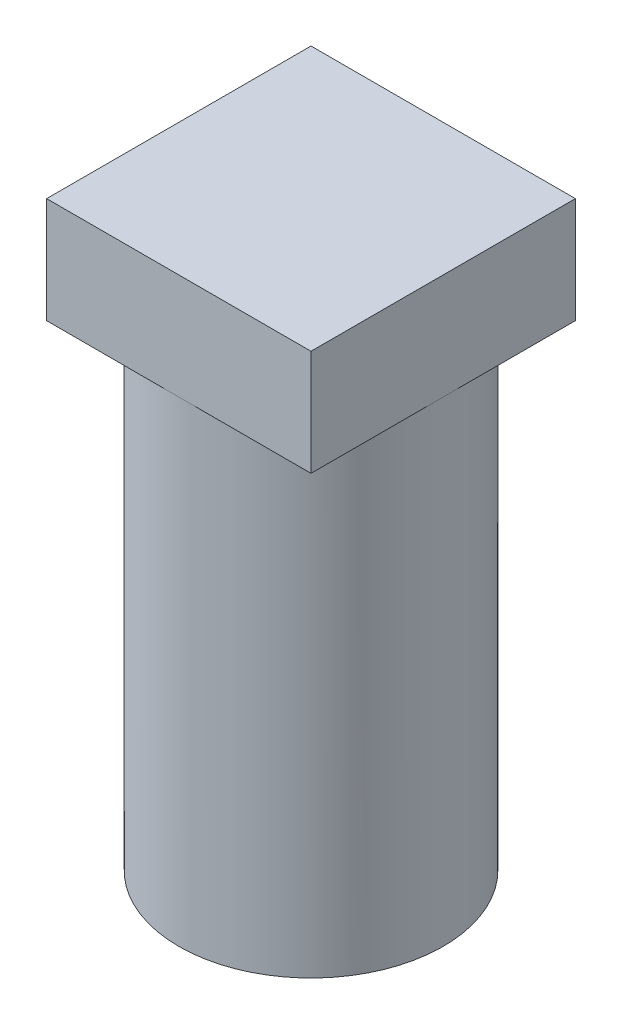
ISO-10303-21;
HEADER;
FILE_DESCRIPTION(('STEP AP214'),'2;1');
FILE_NAME('part.step','',(''),(''),'','','');
FILE_SCHEMA(('AUTOMOTIVE_DESIGN { 1 0 10303 214 1 1 1 1 }'));
ENDSEC;
DATA;
#1=APPLICATION_CONTEXT('core data for automotive mechanical design processes');
#2=APPLICATION_PROTOCOL_DEFINITION('international standard','automotive_design',2000,#1);
#3=PRODUCT_CONTEXT('',#1,'mechanical');
#4=PRODUCT('Part','Part','',(#3));
#5=PRODUCT_RELATED_PRODUCT_CATEGORY('part','',(#4));
#6=PRODUCT_DEFINITION_FORMATION('','',#4);
#7=PRODUCT_DEFINITION_CONTEXT('part definition',#1,'design');
#8=PRODUCT_DEFINITION('design','',#6,#7);
#9=PRODUCT_DEFINITION_SHAPE('','',#8);
#10=(LENGTH_UNIT() NAMED_UNIT(*) SI_UNIT(.MILLI.,.METRE.));
#11=(NAMED_UNIT(*) PLANE_ANGLE_UNIT() SI_UNIT($,.RADIAN.));
#12=(NAMED_UNIT(*) SI_UNIT($,.STERADIAN.) SOLID_ANGLE_UNIT());
#13=UNCERTAINTY_MEASURE_WITH_UNIT(LENGTH_MEASURE(1.E-05),#10,'distance_accuracy_value','');
#14=(GEOMETRIC_REPRESENTATION_CONTEXT(3) GLOBAL_UNCERTAINTY_ASSIGNED_CONTEXT((#13)) GLOBAL_UNIT_ASSIGNED_CONTEXT((#10,
#11,#12)) REPRESENTATION_CONTEXT('',''));
#15=CARTESIAN_POINT('',(0.,0.,0.));
#16=DIRECTION('',(0.,0.,1.));
#17=DIRECTION('',(1.,0.,0.));
#18=AXIS2_PLACEMENT_3D('',#15,#16,#17);
#19=CARTESIAN_POINT('',(0.,12.2870211444059,0.));
#20=DIRECTION('',(0.,-1.,0.));
#21=DIRECTION('',(0.,0.,-1.));
#22=AXIS2_PLACEMENT_3D('',#19,#20,#21);
#23=CYLINDRICAL_SURFACE('',#22,5.);
#24=CARTESIAN_POINT('',(0.,12.2870211444059,0.));
#25=DIRECTION('',(0.,1.,0.));
#26=DIRECTION('',(0.,0.,1.));
#27=AXIS2_PLACEMENT_3D('',#24,#25,#26);
#28=CIRCLE('',#27,5.);
#29=CARTESIAN_POINT('',(0.,12.2870211444059,5.));
#30=VERTEX_POINT('',#29);
#31=CARTESIAN_POINT('',(5.,12.2870211444059,0.));
#32=VERTEX_POINT('',#31);
#33=EDGE_CURVE('E11',#30,#32,#28,.T.);
#34=ORIENTED_EDGE('',*,*,#33,.F.);
#35=CARTESIAN_POINT('',(-5.,12.2870211444059,0.));
#36=VERTEX_POINT('',#35);
#37=EDGE_CURVE('E49',#36,#30,#28,.T.);
#38=ORIENTED_EDGE('',*,*,#37,.F.);
#39=CARTESIAN_POINT('',(0.,12.2870211444059,-5.));
#40=VERTEX_POINT('',#39);
#41=EDGE_CURVE('E59',#40,#36,#28,.T.);
#42=ORIENTED_EDGE('',*,*,#41,.F.);
#43=EDGE_CURVE('E48',#32,#40,#28,.T.);
#44=ORIENTED_EDGE('',*,*,#43,.F.);
#45=EDGE_LOOP('',(#34,#38,#42,#44));
#46=FACE_BOUND('',#45,.T.);
#47=CARTESIAN_POINT('',(0.,-5.71297885559409,0.));
#48=DIRECTION('',(0.,1.,0.));
#49=DIRECTION('',(0.,0.,1.));
#50=AXIS2_PLACEMENT_3D('',#47,#48,#49);
#51=CIRCLE('',#50,5.);
#52=CARTESIAN_POINT('',(0.,-5.71297885559409,5.));
#53=VERTEX_POINT('',#52);
#54=EDGE_CURVE('E43',#53,#53,#51,.T.);
#55=ORIENTED_EDGE('',*,*,#54,.T.);
#56=EDGE_LOOP('',(#55));
#57=FACE_BOUND('',#56,.T.);
#58=ADVANCED_FACE('F40',(#46,#57),#23,.T.);
#59=CARTESIAN_POINT('',(0.,-5.71297885559409,0.));
#60=DIRECTION('',(0.,1.,0.));
#61=DIRECTION('',(0.,0.,1.));
#62=AXIS2_PLACEMENT_3D('',#59,#60,#61);
#63=PLANE('',#62);
#64=ORIENTED_EDGE('',*,*,#54,.F.);
#65=EDGE_LOOP('',(#64));
#66=FACE_BOUND('',#65,.T.);
#67=ADVANCED_FACE('F169',(#66),#63,.F.);
#68=CARTESIAN_POINT('',(0.,12.2870211444059,0.));
#69=DIRECTION('',(0.,1.,0.));
#70=DIRECTION('',(0.,0.,1.));
#71=AXIS2_PLACEMENT_3D('',#68,#69,#70);
#72=PLANE('',#71);
#73=DIRECTION('',(1.,0.,0.));
#74=VECTOR('',#73,1.);
#75=CARTESIAN_POINT('',(-5.,12.2870211444059,5.));
#76=LINE('',#75,#74);
#77=CARTESIAN_POINT('',(5.,12.2870211444059,5.));
#78=VERTEX_POINT('',#77);
#79=EDGE_CURVE('E129',#30,#78,#76,.T.);
#80=ORIENTED_EDGE('',*,*,#79,.F.);
#81=ORIENTED_EDGE('',*,*,#33,.T.);
#82=DIRECTION('',(0.,0.,-1.));
#83=VECTOR('',#82,1.);
#84=CARTESIAN_POINT('',(5.,12.2870211444059,-5.));
#85=LINE('',#84,#83);
#86=EDGE_CURVE('E137',#78,#32,#85,.T.);
#87=ORIENTED_EDGE('',*,*,#86,.F.);
#88=EDGE_LOOP('',(#80,#81,#87));
#89=FACE_BOUND('',#88,.T.);
#90=ADVANCED_FACE('F150',(#89),#72,.F.);
#91=CARTESIAN_POINT('',(5.,12.2870211444059,-5.));
#92=VERTEX_POINT('',#91);
#93=EDGE_CURVE('E116',#32,#92,#85,.T.);
#94=ORIENTED_EDGE('',*,*,#93,.F.);
#95=ORIENTED_EDGE('',*,*,#43,.T.);
#96=DIRECTION('',(-1.,0.,0.));
#97=VECTOR('',#96,1.);
#98=CARTESIAN_POINT('',(-5.,12.2870211444059,-5.));
#99=LINE('',#98,#97);
#100=EDGE_CURVE('E134',#92,#40,#99,.T.);
#101=ORIENTED_EDGE('',*,*,#100,.F.);
#102=EDGE_LOOP('',(#94,#95,#101));
#103=FACE_BOUND('',#102,.T.);
#104=ADVANCED_FACE('F152',(#103),#72,.F.);
#105=CARTESIAN_POINT('',(-5.,12.2870211444059,-5.));
#106=VERTEX_POINT('',#105);
#107=EDGE_CURVE('E136',#40,#106,#99,.T.);
#108=ORIENTED_EDGE('',*,*,#107,.F.);
#109=ORIENTED_EDGE('',*,*,#41,.T.);
#110=DIRECTION('',(0.,0.,1.));
#111=VECTOR('',#110,1.);
#112=CARTESIAN_POINT('',(-5.,12.2870211444059,-5.));
#113=LINE('',#112,#111);
#114=EDGE_CURVE('E130',#106,#36,#113,.T.);
#115=ORIENTED_EDGE('',*,*,#114,.F.);
#116=EDGE_LOOP('',(#108,#109,#115));
#117=FACE_BOUND('',#116,.T.);
#118=ADVANCED_FACE('F156',(#117),#72,.F.);
#119=CARTESIAN_POINT('',(-5.,12.2870211444059,5.));
#120=VERTEX_POINT('',#119);
#121=EDGE_CURVE('E133',#36,#120,#113,.T.);
#122=ORIENTED_EDGE('',*,*,#121,.F.);
#123=ORIENTED_EDGE('',*,*,#37,.T.);
#124=EDGE_CURVE('E111',#120,#30,#76,.T.);
#125=ORIENTED_EDGE('',*,*,#124,.F.);
#126=EDGE_LOOP('',(#122,#123,#125));
#127=FACE_BOUND('',#126,.T.);
#128=ADVANCED_FACE('F158',(#127),#72,.F.);
#129=CARTESIAN_POINT('',(5.,16.2870211444059,-5.));
#130=DIRECTION('',(-1.,0.,0.));
#131=DIRECTION('',(0.,0.,1.));
#132=AXIS2_PLACEMENT_3D('',#129,#130,#131);
#133=PLANE('',#132);
#134=ORIENTED_EDGE('',*,*,#86,.T.);
#135=ORIENTED_EDGE('',*,*,#93,.T.);
#136=DIRECTION('',(0.,-1.,0.));
#137=VECTOR('',#136,1.);
#138=CARTESIAN_POINT('',(5.,16.2870211444059,-5.));
#139=LINE('',#138,#137);
#140=CARTESIAN_POINT('',(5.,16.2870211444059,-5.));
#141=VERTEX_POINT('',#140);
#142=EDGE_CURVE('E96',#141,#92,#139,.T.);
#143=ORIENTED_EDGE('',*,*,#142,.F.);
#144=DIRECTION('',(0.,0.,-1.));
#145=VECTOR('',#144,1.);
#146=CARTESIAN_POINT('',(5.,16.2870211444059,-5.));
#147=LINE('',#146,#145);
#148=CARTESIAN_POINT('',(5.,16.2870211444059,5.));
#149=VERTEX_POINT('',#148);
#150=EDGE_CURVE('E102',#149,#141,#147,.T.);
#151=ORIENTED_EDGE('',*,*,#150,.F.);
#152=DIRECTION('',(0.,-1.,0.));
#153=VECTOR('',#152,1.);
#154=CARTESIAN_POINT('',(5.,16.2870211444059,5.));
#155=LINE('',#154,#153);
#156=EDGE_CURVE('E125',#149,#78,#155,.T.);
#157=ORIENTED_EDGE('',*,*,#156,.T.);
#158=EDGE_LOOP('',(#134,#135,#143,#151,#157));
#159=FACE_BOUND('',#158,.T.);
#160=ADVANCED_FACE('F114',(#159),#133,.F.);
#161=CARTESIAN_POINT('',(-5.,16.2870211444059,-5.));
#162=DIRECTION('',(0.,0.,1.));
#163=DIRECTION('',(1.,0.,0.));
#164=AXIS2_PLACEMENT_3D('',#161,#162,#163);
#165=PLANE('',#164);
#166=ORIENTED_EDGE('',*,*,#100,.T.);
#167=ORIENTED_EDGE('',*,*,#107,.T.);
#168=DIRECTION('',(0.,-1.,0.));
#169=VECTOR('',#168,1.);
#170=CARTESIAN_POINT('',(-5.,16.2870211444059,-5.));
#171=LINE('',#170,#169);
#172=CARTESIAN_POINT('',(-5.,16.2870211444059,-5.));
#173=VERTEX_POINT('',#172);
#174=EDGE_CURVE('E98',#173,#106,#171,.T.);
#175=ORIENTED_EDGE('',*,*,#174,.F.);
#176=DIRECTION('',(-1.,0.,0.));
#177=VECTOR('',#176,1.);
#178=CARTESIAN_POINT('',(-5.,16.2870211444059,-5.));
#179=LINE('',#178,#177);
#180=EDGE_CURVE('E91',#141,#173,#179,.T.);
#181=ORIENTED_EDGE('',*,*,#180,.F.);
#182=ORIENTED_EDGE('',*,*,#142,.T.);
#183=EDGE_LOOP('',(#166,#167,#175,#181,#182));
#184=FACE_BOUND('',#183,.T.);
#185=ADVANCED_FACE('F94',(#184),#165,.F.);
#186=CARTESIAN_POINT('',(-5.,16.2870211444059,-5.));
#187=DIRECTION('',(1.,0.,0.));
#188=DIRECTION('',(0.,0.,-1.));
#189=AXIS2_PLACEMENT_3D('',#186,#187,#188);
#190=PLANE('',#189);
#191=ORIENTED_EDGE('',*,*,#114,.T.);
#192=ORIENTED_EDGE('',*,*,#121,.T.);
#193=DIRECTION('',(0.,-1.,0.));
#194=VECTOR('',#193,1.);
#195=CARTESIAN_POINT('',(-5.,16.2870211444059,5.));
#196=LINE('',#195,#194);
#197=CARTESIAN_POINT('',(-5.,16.2870211444059,5.));
#198=VERTEX_POINT('',#197);
#199=EDGE_CURVE('E120',#198,#120,#196,.T.);
#200=ORIENTED_EDGE('',*,*,#199,.F.);
#201=DIRECTION('',(0.,0.,1.));
#202=VECTOR('',#201,1.);
#203=CARTESIAN_POINT('',(-5.,16.2870211444059,-5.));
#204=LINE('',#203,#202);
#205=EDGE_CURVE('E101',#173,#198,#204,.T.);
#206=ORIENTED_EDGE('',*,*,#205,.F.);
#207=ORIENTED_EDGE('',*,*,#174,.T.);
#208=EDGE_LOOP('',(#191,#192,#200,#206,#207));
#209=FACE_BOUND('',#208,.T.);
#210=ADVANCED_FACE('F142',(#209),#190,.F.);
#211=CARTESIAN_POINT('',(-5.,16.2870211444059,5.));
#212=DIRECTION('',(0.,0.,-1.));
#213=DIRECTION('',(-1.,0.,0.));
#214=AXIS2_PLACEMENT_3D('',#211,#212,#213);
#215=PLANE('',#214);
#216=ORIENTED_EDGE('',*,*,#124,.T.);
#217=ORIENTED_EDGE('',*,*,#79,.T.);
#218=ORIENTED_EDGE('',*,*,#156,.F.);
#219=DIRECTION('',(1.,0.,0.));
#220=VECTOR('',#219,1.);
#221=CARTESIAN_POINT('',(-5.,16.2870211444059,5.));
#222=LINE('',#221,#220);
#223=EDGE_CURVE('E107',#198,#149,#222,.T.);
#224=ORIENTED_EDGE('',*,*,#223,.F.);
#225=ORIENTED_EDGE('',*,*,#199,.T.);
#226=EDGE_LOOP('',(#216,#217,#218,#224,#225));
#227=FACE_BOUND('',#226,.T.);
#228=ADVANCED_FACE('F146',(#227),#215,.F.);
#229=CARTESIAN_POINT('',(0.,16.2870211444059,0.));
#230=DIRECTION('',(0.,1.,0.));
#231=DIRECTION('',(0.,0.,1.));
#232=AXIS2_PLACEMENT_3D('',#229,#230,#231);
#233=PLANE('',#232);
#234=ORIENTED_EDGE('',*,*,#150,.T.);
#235=ORIENTED_EDGE('',*,*,#180,.T.);
#236=ORIENTED_EDGE('',*,*,#205,.T.);
#237=ORIENTED_EDGE('',*,*,#223,.T.);
#238=EDGE_LOOP('',(#234,#235,#236,#237));
#239=FACE_BOUND('',#238,.T.);
#240=ADVANCED_FACE('F105',(#239),#233,.T.);
#241=CLOSED_SHELL('',(#58,#67,#90,#104,#118,#128,#160,#185,#210,#228,#240));
#242=MANIFOLD_SOLID_BREP('B2',#241);
#243=ADVANCED_BREP_SHAPE_REPRESENTATION('',(#18,#242),#14);
#244=SHAPE_DEFINITION_REPRESENTATION(#9,#243);
ENDSEC;
END-ISO-10303-21;
